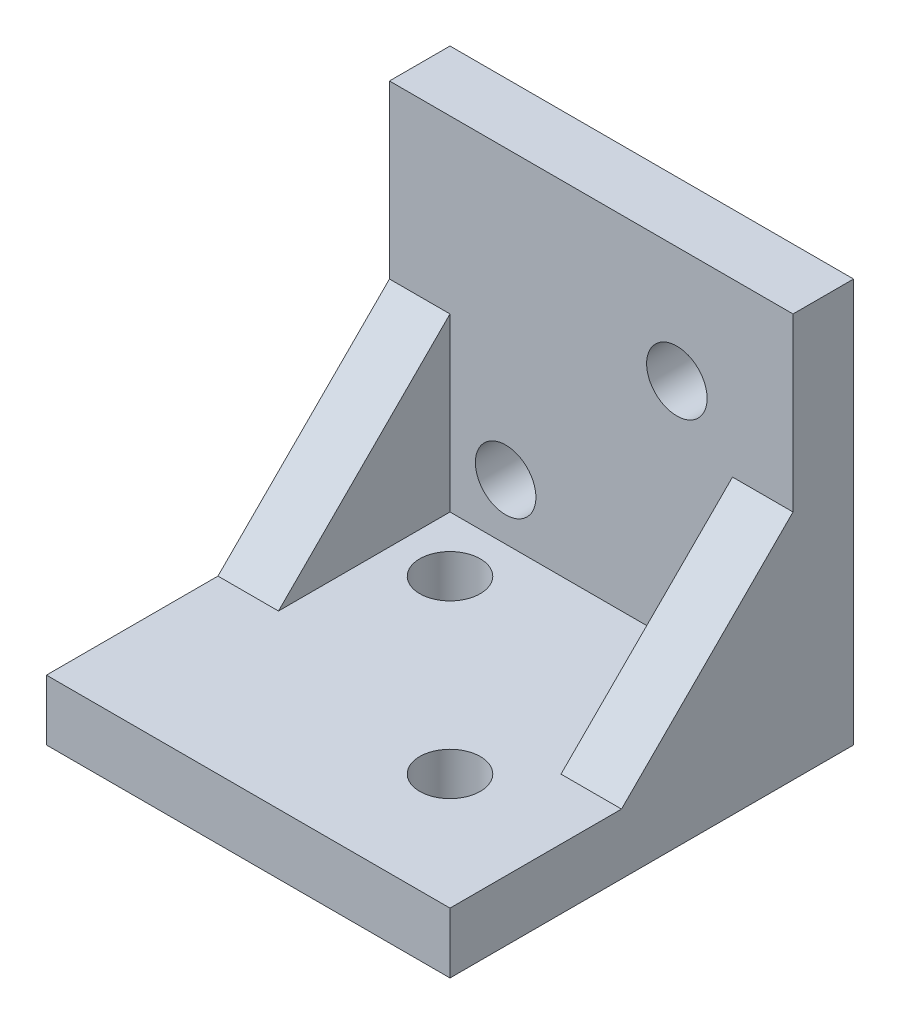
ISO-10303-21;
HEADER;
FILE_DESCRIPTION(('STEP AP214'),'2;1');
FILE_NAME('part.step','',(''),(''),'','','');
FILE_SCHEMA(('AUTOMOTIVE_DESIGN { 1 0 10303 214 1 1 1 1 }'));
ENDSEC;
DATA;
#1=APPLICATION_CONTEXT('core data for automotive mechanical design processes');
#2=APPLICATION_PROTOCOL_DEFINITION('international standard','automotive_design',2000,#1);
#3=PRODUCT_CONTEXT('',#1,'mechanical');
#4=PRODUCT('Part','Part','',(#3));
#5=PRODUCT_RELATED_PRODUCT_CATEGORY('part','',(#4));
#6=PRODUCT_DEFINITION_FORMATION('','',#4);
#7=PRODUCT_DEFINITION_CONTEXT('part definition',#1,'design');
#8=PRODUCT_DEFINITION('design','',#6,#7);
#9=PRODUCT_DEFINITION_SHAPE('','',#8);
#10=(LENGTH_UNIT() NAMED_UNIT(*) SI_UNIT(.MILLI.,.METRE.));
#11=(NAMED_UNIT(*) PLANE_ANGLE_UNIT() SI_UNIT($,.RADIAN.));
#12=(NAMED_UNIT(*) SI_UNIT($,.STERADIAN.) SOLID_ANGLE_UNIT());
#13=UNCERTAINTY_MEASURE_WITH_UNIT(LENGTH_MEASURE(1.E-05),#10,'distance_accuracy_value','');
#14=(GEOMETRIC_REPRESENTATION_CONTEXT(3) GLOBAL_UNCERTAINTY_ASSIGNED_CONTEXT((#13)) GLOBAL_UNIT_ASSIGNED_CONTEXT((#10,
#11,#12)) REPRESENTATION_CONTEXT('',''));
#15=CARTESIAN_POINT('',(0.,0.,0.));
#16=DIRECTION('',(0.,0.,1.));
#17=DIRECTION('',(1.,0.,0.));
#18=AXIS2_PLACEMENT_3D('',#15,#16,#17);
#19=CARTESIAN_POINT('',(0.,3.,0.));
#20=DIRECTION('',(0.,-1.,0.));
#21=DIRECTION('',(0.,0.,-1.));
#22=AXIS2_PLACEMENT_3D('',#19,#20,#21);
#23=PLANE('',#22);
#24=CARTESIAN_POINT('',(-4.24264068711929,3.,-4.24264068711928));
#25=DIRECTION('',(0.,1.,0.));
#26=DIRECTION('',(0.,0.,1.));
#27=AXIS2_PLACEMENT_3D('',#24,#25,#26);
#28=CIRCLE('',#27,1.50000000000001);
#29=CARTESIAN_POINT('',(-4.24264068711929,3.,-2.74264068711928));
#30=VERTEX_POINT('',#29);
#31=EDGE_CURVE('E215',#30,#30,#28,.T.);
#32=ORIENTED_EDGE('',*,*,#31,.F.);
#33=EDGE_LOOP('',(#32));
#34=FACE_BOUND('',#33,.T.);
#35=CARTESIAN_POINT('',(4.24264068711928,3.,4.24264068711928));
#36=DIRECTION('',(0.,1.,0.));
#37=DIRECTION('',(0.,0.,1.));
#38=AXIS2_PLACEMENT_3D('',#35,#36,#37);
#39=CIRCLE('',#38,1.5);
#40=CARTESIAN_POINT('',(4.24264068711928,3.,5.74264068711928));
#41=VERTEX_POINT('',#40);
#42=EDGE_CURVE('E207',#41,#41,#39,.T.);
#43=ORIENTED_EDGE('',*,*,#42,.F.);
#44=EDGE_LOOP('',(#43));
#45=FACE_BOUND('',#44,.T.);
#46=DIRECTION('',(1.,0.,0.));
#47=VECTOR('',#46,1.);
#48=CARTESIAN_POINT('',(7.,3.,1.5));
#49=LINE('',#48,#47);
#50=CARTESIAN_POINT('',(7.,3.,1.5));
#51=VERTEX_POINT('',#50);
#52=CARTESIAN_POINT('',(10.,3.,1.5));
#53=VERTEX_POINT('',#52);
#54=EDGE_CURVE('E142',#51,#53,#49,.T.);
#55=ORIENTED_EDGE('',*,*,#54,.F.);
#56=DIRECTION('',(0.,0.,1.));
#57=VECTOR('',#56,1.);
#58=CARTESIAN_POINT('',(7.,3.,10.));
#59=LINE('',#58,#57);
#60=CARTESIAN_POINT('',(7.,3.,-7.));
#61=VERTEX_POINT('',#60);
#62=EDGE_CURVE('E127',#61,#51,#59,.T.);
#63=ORIENTED_EDGE('',*,*,#62,.F.);
#64=DIRECTION('',(1.,0.,0.));
#65=VECTOR('',#64,1.);
#66=CARTESIAN_POINT('',(-10.,3.,-7.));
#67=LINE('',#66,#65);
#68=CARTESIAN_POINT('',(-7.,3.,-7.));
#69=VERTEX_POINT('',#68);
#70=EDGE_CURVE('E146',#69,#61,#67,.T.);
#71=ORIENTED_EDGE('',*,*,#70,.F.);
#72=DIRECTION('',(0.,0.,1.));
#73=VECTOR('',#72,1.);
#74=CARTESIAN_POINT('',(-7.,3.,1.5));
#75=LINE('',#74,#73);
#76=CARTESIAN_POINT('',(-7.,3.,1.5));
#77=VERTEX_POINT('',#76);
#78=EDGE_CURVE('E61',#69,#77,#75,.T.);
#79=ORIENTED_EDGE('',*,*,#78,.T.);
#80=DIRECTION('',(-1.,0.,0.));
#81=VECTOR('',#80,1.);
#82=CARTESIAN_POINT('',(-7.,3.,1.5));
#83=LINE('',#82,#81);
#84=CARTESIAN_POINT('',(-10.,3.,1.5));
#85=VERTEX_POINT('',#84);
#86=EDGE_CURVE('E65',#77,#85,#83,.T.);
#87=ORIENTED_EDGE('',*,*,#86,.T.);
#88=DIRECTION('',(0.,0.,1.));
#89=VECTOR('',#88,1.);
#90=CARTESIAN_POINT('',(-10.,3.,10.));
#91=LINE('',#90,#89);
#92=CARTESIAN_POINT('',(-10.,3.,10.));
#93=VERTEX_POINT('',#92);
#94=EDGE_CURVE('E227',#85,#93,#91,.T.);
#95=ORIENTED_EDGE('',*,*,#94,.T.);
#96=DIRECTION('',(1.,0.,0.));
#97=VECTOR('',#96,1.);
#98=CARTESIAN_POINT('',(-10.,3.,10.));
#99=LINE('',#98,#97);
#100=CARTESIAN_POINT('',(10.,3.,10.));
#101=VERTEX_POINT('',#100);
#102=EDGE_CURVE('E231',#93,#101,#99,.T.);
#103=ORIENTED_EDGE('',*,*,#102,.T.);
#104=DIRECTION('',(0.,0.,-1.));
#105=VECTOR('',#104,1.);
#106=CARTESIAN_POINT('',(10.,3.,10.));
#107=LINE('',#106,#105);
#108=EDGE_CURVE('E223',#101,#53,#107,.T.);
#109=ORIENTED_EDGE('',*,*,#108,.T.);
#110=EDGE_LOOP('',(#55,#63,#71,#79,#87,#95,#103,#109));
#111=FACE_BOUND('',#110,.T.);
#112=ADVANCED_FACE('F43',(#34,#45,#111),#23,.F.);
#113=CARTESIAN_POINT('',(-10.,20.,-7.));
#114=DIRECTION('',(0.,0.,-1.));
#115=DIRECTION('',(-1.,0.,0.));
#116=AXIS2_PLACEMENT_3D('',#113,#114,#115);
#117=PLANE('',#116);
#118=CARTESIAN_POINT('',(-4.24264068711928,5.75735931288072,-7.));
#119=DIRECTION('',(0.,0.,-1.));
#120=DIRECTION('',(-1.,0.,0.));
#121=AXIS2_PLACEMENT_3D('',#118,#119,#120);
#122=CIRCLE('',#121,1.5);
#123=CARTESIAN_POINT('',(-5.74264068711928,5.75735931288072,-7.));
#124=VERTEX_POINT('',#123);
#125=EDGE_CURVE('E179',#124,#124,#122,.T.);
#126=ORIENTED_EDGE('',*,*,#125,.T.);
#127=EDGE_LOOP('',(#126));
#128=FACE_BOUND('',#127,.T.);
#129=CARTESIAN_POINT('',(4.24264068711928,14.2426406871193,-7.));
#130=DIRECTION('',(0.,0.,-1.));
#131=DIRECTION('',(-1.,0.,0.));
#132=AXIS2_PLACEMENT_3D('',#129,#130,#131);
#133=CIRCLE('',#132,1.5);
#134=CARTESIAN_POINT('',(2.74264068711928,14.2426406871193,-7.));
#135=VERTEX_POINT('',#134);
#136=EDGE_CURVE('E47',#135,#135,#133,.T.);
#137=ORIENTED_EDGE('',*,*,#136,.T.);
#138=EDGE_LOOP('',(#137));
#139=FACE_BOUND('',#138,.T.);
#140=DIRECTION('',(1.,0.,0.));
#141=VECTOR('',#140,1.);
#142=CARTESIAN_POINT('',(7.,11.5,-7.));
#143=LINE('',#142,#141);
#144=CARTESIAN_POINT('',(7.,11.5,-7.));
#145=VERTEX_POINT('',#144);
#146=CARTESIAN_POINT('',(10.,11.5,-7.));
#147=VERTEX_POINT('',#146);
#148=EDGE_CURVE('E134',#145,#147,#143,.T.);
#149=ORIENTED_EDGE('',*,*,#148,.T.);
#150=DIRECTION('',(0.,-1.,0.));
#151=VECTOR('',#150,1.);
#152=CARTESIAN_POINT('',(10.,20.,-7.));
#153=LINE('',#152,#151);
#154=CARTESIAN_POINT('',(10.,20.,-7.));
#155=VERTEX_POINT('',#154);
#156=EDGE_CURVE('E198',#155,#147,#153,.T.);
#157=ORIENTED_EDGE('',*,*,#156,.F.);
#158=DIRECTION('',(1.,0.,0.));
#159=VECTOR('',#158,1.);
#160=CARTESIAN_POINT('',(-10.,20.,-7.));
#161=LINE('',#160,#159);
#162=CARTESIAN_POINT('',(-10.,20.,-7.));
#163=VERTEX_POINT('',#162);
#164=EDGE_CURVE('E187',#163,#155,#161,.T.);
#165=ORIENTED_EDGE('',*,*,#164,.F.);
#166=DIRECTION('',(0.,-1.,0.));
#167=VECTOR('',#166,1.);
#168=CARTESIAN_POINT('',(-10.,20.,-7.));
#169=LINE('',#168,#167);
#170=CARTESIAN_POINT('',(-10.,11.5,-7.));
#171=VERTEX_POINT('',#170);
#172=EDGE_CURVE('E203',#163,#171,#169,.T.);
#173=ORIENTED_EDGE('',*,*,#172,.T.);
#174=DIRECTION('',(-1.,0.,0.));
#175=VECTOR('',#174,1.);
#176=CARTESIAN_POINT('',(-7.,11.5,-7.));
#177=LINE('',#176,#175);
#178=CARTESIAN_POINT('',(-7.,11.5,-7.));
#179=VERTEX_POINT('',#178);
#180=EDGE_CURVE('E168',#179,#171,#177,.T.);
#181=ORIENTED_EDGE('',*,*,#180,.F.);
#182=DIRECTION('',(0.,-1.,0.));
#183=VECTOR('',#182,1.);
#184=CARTESIAN_POINT('',(-7.,3.,-7.));
#185=LINE('',#184,#183);
#186=EDGE_CURVE('E156',#179,#69,#185,.T.);
#187=ORIENTED_EDGE('',*,*,#186,.T.);
#188=ORIENTED_EDGE('',*,*,#70,.T.);
#189=DIRECTION('',(0.,-1.,0.));
#190=VECTOR('',#189,1.);
#191=CARTESIAN_POINT('',(7.,3.,-7.));
#192=LINE('',#191,#190);
#193=EDGE_CURVE('E125',#145,#61,#192,.T.);
#194=ORIENTED_EDGE('',*,*,#193,.F.);
#195=EDGE_LOOP('',(#149,#157,#165,#173,#181,#187,#188,#194));
#196=FACE_BOUND('',#195,.T.);
#197=ADVANCED_FACE('F145',(#128,#139,#196),#117,.F.);
#198=CARTESIAN_POINT('',(0.,0.,0.));
#199=DIRECTION('',(0.,-1.,0.));
#200=DIRECTION('',(0.,0.,-1.));
#201=AXIS2_PLACEMENT_3D('',#198,#199,#200);
#202=PLANE('',#201);
#203=CARTESIAN_POINT('',(-4.24264068711929,0.,-4.24264068711928));
#204=DIRECTION('',(0.,1.,0.));
#205=DIRECTION('',(0.,0.,1.));
#206=AXIS2_PLACEMENT_3D('',#203,#204,#205);
#207=CIRCLE('',#206,1.50000000000001);
#208=CARTESIAN_POINT('',(-4.24264068711929,0.,-2.74264068711928));
#209=VERTEX_POINT('',#208);
#210=EDGE_CURVE('E211',#209,#209,#207,.T.);
#211=ORIENTED_EDGE('',*,*,#210,.T.);
#212=EDGE_LOOP('',(#211));
#213=FACE_BOUND('',#212,.T.);
#214=DIRECTION('',(0.,0.,-1.));
#215=VECTOR('',#214,1.);
#216=CARTESIAN_POINT('',(10.,0.,10.));
#217=LINE('',#216,#215);
#218=CARTESIAN_POINT('',(10.,0.,10.));
#219=VERTEX_POINT('',#218);
#220=CARTESIAN_POINT('',(10.,0.,-10.));
#221=VERTEX_POINT('',#220);
#222=EDGE_CURVE('E219',#219,#221,#217,.T.);
#223=ORIENTED_EDGE('',*,*,#222,.F.);
#224=DIRECTION('',(1.,0.,0.));
#225=VECTOR('',#224,1.);
#226=CARTESIAN_POINT('',(-10.,0.,10.));
#227=LINE('',#226,#225);
#228=CARTESIAN_POINT('',(-10.,0.,10.));
#229=VERTEX_POINT('',#228);
#230=EDGE_CURVE('E228',#229,#219,#227,.T.);
#231=ORIENTED_EDGE('',*,*,#230,.F.);
#232=DIRECTION('',(0.,0.,1.));
#233=VECTOR('',#232,1.);
#234=CARTESIAN_POINT('',(-10.,0.,10.));
#235=LINE('',#234,#233);
#236=CARTESIAN_POINT('',(-10.,0.,-10.));
#237=VERTEX_POINT('',#236);
#238=EDGE_CURVE('E241',#237,#229,#235,.T.);
#239=ORIENTED_EDGE('',*,*,#238,.F.);
#240=DIRECTION('',(-1.,0.,0.));
#241=VECTOR('',#240,1.);
#242=CARTESIAN_POINT('',(-10.,0.,-10.));
#243=LINE('',#242,#241);
#244=EDGE_CURVE('E238',#221,#237,#243,.T.);
#245=ORIENTED_EDGE('',*,*,#244,.F.);
#246=EDGE_LOOP('',(#223,#231,#239,#245));
#247=FACE_BOUND('',#246,.T.);
#248=CARTESIAN_POINT('',(4.24264068711928,0.,4.24264068711928));
#249=DIRECTION('',(0.,1.,0.));
#250=DIRECTION('',(0.,0.,1.));
#251=AXIS2_PLACEMENT_3D('',#248,#249,#250);
#252=CIRCLE('',#251,1.5);
#253=CARTESIAN_POINT('',(4.24264068711928,0.,5.74264068711928));
#254=VERTEX_POINT('',#253);
#255=EDGE_CURVE('E206',#254,#254,#252,.T.);
#256=ORIENTED_EDGE('',*,*,#255,.T.);
#257=EDGE_LOOP('',(#256));
#258=FACE_BOUND('',#257,.T.);
#259=ADVANCED_FACE('F286',(#213,#247,#258),#202,.T.);
#260=CARTESIAN_POINT('',(10.,3.,10.));
#261=DIRECTION('',(-1.,0.,0.));
#262=DIRECTION('',(0.,0.,1.));
#263=AXIS2_PLACEMENT_3D('',#260,#261,#262);
#264=PLANE('',#263);
#265=DIRECTION('',(0.,0.707106781186548,-0.707106781186547));
#266=VECTOR('',#265,1.);
#267=CARTESIAN_POINT('',(10.,-1.25,5.75));
#268=LINE('',#267,#266);
#269=EDGE_CURVE('E131',#53,#147,#268,.T.);
#270=ORIENTED_EDGE('',*,*,#269,.F.);
#271=ORIENTED_EDGE('',*,*,#108,.F.);
#272=DIRECTION('',(0.,-1.,0.));
#273=VECTOR('',#272,1.);
#274=CARTESIAN_POINT('',(10.,3.,10.));
#275=LINE('',#274,#273);
#276=EDGE_CURVE('E234',#101,#219,#275,.T.);
#277=ORIENTED_EDGE('',*,*,#276,.T.);
#278=ORIENTED_EDGE('',*,*,#222,.T.);
#279=DIRECTION('',(0.,-1.,0.));
#280=VECTOR('',#279,1.);
#281=CARTESIAN_POINT('',(10.,3.,-10.));
#282=LINE('',#281,#280);
#283=CARTESIAN_POINT('',(10.,20.,-10.));
#284=VERTEX_POINT('',#283);
#285=EDGE_CURVE('E11',#284,#221,#282,.T.);
#286=ORIENTED_EDGE('',*,*,#285,.F.);
#287=DIRECTION('',(0.,0.,-1.));
#288=VECTOR('',#287,1.);
#289=CARTESIAN_POINT('',(10.,20.,-10.));
#290=LINE('',#289,#288);
#291=EDGE_CURVE('E190',#155,#284,#290,.T.);
#292=ORIENTED_EDGE('',*,*,#291,.F.);
#293=ORIENTED_EDGE('',*,*,#156,.T.);
#294=EDGE_LOOP('',(#270,#271,#277,#278,#286,#292,#293));
#295=FACE_BOUND('',#294,.T.);
#296=ADVANCED_FACE('F45',(#295),#264,.F.);
#297=CARTESIAN_POINT('',(-10.,3.,-10.));
#298=DIRECTION('',(0.,0.,1.));
#299=DIRECTION('',(1.,0.,0.));
#300=AXIS2_PLACEMENT_3D('',#297,#298,#299);
#301=PLANE('',#300);
#302=CARTESIAN_POINT('',(4.24264068711928,14.2426406871193,-10.));
#303=DIRECTION('',(0.,0.,-1.));
#304=DIRECTION('',(-1.,0.,0.));
#305=AXIS2_PLACEMENT_3D('',#302,#303,#304);
#306=CIRCLE('',#305,1.5);
#307=CARTESIAN_POINT('',(2.74264068711928,14.2426406871193,-10.));
#308=VERTEX_POINT('',#307);
#309=EDGE_CURVE('E175',#308,#308,#306,.T.);
#310=ORIENTED_EDGE('',*,*,#309,.F.);
#311=EDGE_LOOP('',(#310));
#312=FACE_BOUND('',#311,.T.);
#313=CARTESIAN_POINT('',(-4.24264068711928,5.75735931288072,-10.));
#314=DIRECTION('',(0.,0.,-1.));
#315=DIRECTION('',(-1.,0.,0.));
#316=AXIS2_PLACEMENT_3D('',#313,#314,#315);
#317=CIRCLE('',#316,1.5);
#318=CARTESIAN_POINT('',(-5.74264068711928,5.75735931288072,-10.));
#319=VERTEX_POINT('',#318);
#320=EDGE_CURVE('E172',#319,#319,#317,.T.);
#321=ORIENTED_EDGE('',*,*,#320,.F.);
#322=EDGE_LOOP('',(#321));
#323=FACE_BOUND('',#322,.T.);
#324=ORIENTED_EDGE('',*,*,#244,.T.);
#325=DIRECTION('',(0.,-1.,0.));
#326=VECTOR('',#325,1.);
#327=CARTESIAN_POINT('',(-10.,3.,-10.));
#328=LINE('',#327,#326);
#329=CARTESIAN_POINT('',(-10.,20.,-10.));
#330=VERTEX_POINT('',#329);
#331=EDGE_CURVE('E53',#330,#237,#328,.T.);
#332=ORIENTED_EDGE('',*,*,#331,.F.);
#333=DIRECTION('',(-1.,0.,0.));
#334=VECTOR('',#333,1.);
#335=CARTESIAN_POINT('',(-10.,20.,-10.));
#336=LINE('',#335,#334);
#337=EDGE_CURVE('E194',#284,#330,#336,.T.);
#338=ORIENTED_EDGE('',*,*,#337,.F.);
#339=ORIENTED_EDGE('',*,*,#285,.T.);
#340=EDGE_LOOP('',(#324,#332,#338,#339));
#341=FACE_BOUND('',#340,.T.);
#342=ADVANCED_FACE('F303',(#312,#323,#341),#301,.F.);
#343=CARTESIAN_POINT('',(-10.,3.,10.));
#344=DIRECTION('',(1.,0.,0.));
#345=DIRECTION('',(0.,0.,-1.));
#346=AXIS2_PLACEMENT_3D('',#343,#344,#345);
#347=PLANE('',#346);
#348=ORIENTED_EDGE('',*,*,#94,.F.);
#349=DIRECTION('',(0.,0.707106781186548,-0.707106781186547));
#350=VECTOR('',#349,1.);
#351=CARTESIAN_POINT('',(-10.,11.5,-7.));
#352=LINE('',#351,#350);
#353=EDGE_CURVE('E141',#85,#171,#352,.T.);
#354=ORIENTED_EDGE('',*,*,#353,.T.);
#355=ORIENTED_EDGE('',*,*,#172,.F.);
#356=DIRECTION('',(0.,0.,1.));
#357=VECTOR('',#356,1.);
#358=CARTESIAN_POINT('',(-10.,20.,-10.));
#359=LINE('',#358,#357);
#360=EDGE_CURVE('E183',#330,#163,#359,.T.);
#361=ORIENTED_EDGE('',*,*,#360,.F.);
#362=ORIENTED_EDGE('',*,*,#331,.T.);
#363=ORIENTED_EDGE('',*,*,#238,.T.);
#364=DIRECTION('',(0.,-1.,0.));
#365=VECTOR('',#364,1.);
#366=CARTESIAN_POINT('',(-10.,3.,10.));
#367=LINE('',#366,#365);
#368=EDGE_CURVE('E249',#93,#229,#367,.T.);
#369=ORIENTED_EDGE('',*,*,#368,.F.);
#370=EDGE_LOOP('',(#348,#354,#355,#361,#362,#363,#369));
#371=FACE_BOUND('',#370,.T.);
#372=ADVANCED_FACE('F300',(#371),#347,.F.);
#373=CARTESIAN_POINT('',(-10.,3.,10.));
#374=DIRECTION('',(0.,0.,-1.));
#375=DIRECTION('',(-1.,0.,0.));
#376=AXIS2_PLACEMENT_3D('',#373,#374,#375);
#377=PLANE('',#376);
#378=ORIENTED_EDGE('',*,*,#230,.T.);
#379=ORIENTED_EDGE('',*,*,#276,.F.);
#380=ORIENTED_EDGE('',*,*,#102,.F.);
#381=ORIENTED_EDGE('',*,*,#368,.T.);
#382=EDGE_LOOP('',(#378,#379,#380,#381));
#383=FACE_BOUND('',#382,.T.);
#384=ADVANCED_FACE('F297',(#383),#377,.F.);
#385=CARTESIAN_POINT('',(-4.24264068711929,3.,-4.24264068711928));
#386=DIRECTION('',(0.,-1.,0.));
#387=DIRECTION('',(0.,0.,-1.));
#388=AXIS2_PLACEMENT_3D('',#385,#386,#387);
#389=CYLINDRICAL_SURFACE('',#388,1.50000000000001);
#390=ORIENTED_EDGE('',*,*,#31,.T.);
#391=EDGE_LOOP('',(#390));
#392=FACE_BOUND('',#391,.T.);
#393=ORIENTED_EDGE('',*,*,#210,.F.);
#394=EDGE_LOOP('',(#393));
#395=FACE_BOUND('',#394,.T.);
#396=ADVANCED_FACE('F292',(#392,#395),#389,.F.);
#397=CARTESIAN_POINT('',(4.24264068711928,3.,4.24264068711928));
#398=DIRECTION('',(0.,-1.,0.));
#399=DIRECTION('',(0.,0.,-1.));
#400=AXIS2_PLACEMENT_3D('',#397,#398,#399);
#401=CYLINDRICAL_SURFACE('',#400,1.5);
#402=ORIENTED_EDGE('',*,*,#42,.T.);
#403=EDGE_LOOP('',(#402));
#404=FACE_BOUND('',#403,.T.);
#405=ORIENTED_EDGE('',*,*,#255,.F.);
#406=EDGE_LOOP('',(#405));
#407=FACE_BOUND('',#406,.T.);
#408=ADVANCED_FACE('F409',(#404,#407),#401,.F.);
#409=CARTESIAN_POINT('',(0.,20.,0.));
#410=DIRECTION('',(0.,1.,0.));
#411=DIRECTION('',(0.,0.,1.));
#412=AXIS2_PLACEMENT_3D('',#409,#410,#411);
#413=PLANE('',#412);
#414=ORIENTED_EDGE('',*,*,#360,.T.);
#415=ORIENTED_EDGE('',*,*,#164,.T.);
#416=ORIENTED_EDGE('',*,*,#291,.T.);
#417=ORIENTED_EDGE('',*,*,#337,.T.);
#418=EDGE_LOOP('',(#414,#415,#416,#417));
#419=FACE_BOUND('',#418,.T.);
#420=ADVANCED_FACE('F277',(#419),#413,.T.);
#421=CARTESIAN_POINT('',(-4.24264068711928,5.75735931288072,20.));
#422=DIRECTION('',(0.,0.,-1.));
#423=DIRECTION('',(-1.,0.,0.));
#424=AXIS2_PLACEMENT_3D('',#421,#422,#423);
#425=CYLINDRICAL_SURFACE('',#424,1.5);
#426=ORIENTED_EDGE('',*,*,#320,.T.);
#427=EDGE_LOOP('',(#426));
#428=FACE_BOUND('',#427,.T.);
#429=ORIENTED_EDGE('',*,*,#125,.F.);
#430=EDGE_LOOP('',(#429));
#431=FACE_BOUND('',#430,.T.);
#432=ADVANCED_FACE('F267',(#428,#431),#425,.F.);
#433=CARTESIAN_POINT('',(4.24264068711928,14.2426406871193,20.));
#434=DIRECTION('',(0.,0.,-1.));
#435=DIRECTION('',(-1.,0.,0.));
#436=AXIS2_PLACEMENT_3D('',#433,#434,#435);
#437=CYLINDRICAL_SURFACE('',#436,1.5);
#438=ORIENTED_EDGE('',*,*,#309,.T.);
#439=EDGE_LOOP('',(#438));
#440=FACE_BOUND('',#439,.T.);
#441=ORIENTED_EDGE('',*,*,#136,.F.);
#442=EDGE_LOOP('',(#441));
#443=FACE_BOUND('',#442,.T.);
#444=ADVANCED_FACE('F264',(#440,#443),#437,.F.);
#445=CARTESIAN_POINT('',(-7.,11.5,-7.));
#446=DIRECTION('',(0.,0.707106781186547,0.707106781186548));
#447=DIRECTION('',(0.,-0.707106781186548,0.707106781186547));
#448=AXIS2_PLACEMENT_3D('',#445,#446,#447);
#449=PLANE('',#448);
#450=ORIENTED_EDGE('',*,*,#353,.F.);
#451=ORIENTED_EDGE('',*,*,#86,.F.);
#452=DIRECTION('',(0.,0.707106781186548,-0.707106781186547));
#453=VECTOR('',#452,1.);
#454=CARTESIAN_POINT('',(-7.,11.5,-7.));
#455=LINE('',#454,#453);
#456=EDGE_CURVE('E161',#77,#179,#455,.T.);
#457=ORIENTED_EDGE('',*,*,#456,.T.);
#458=ORIENTED_EDGE('',*,*,#180,.T.);
#459=EDGE_LOOP('',(#450,#451,#457,#458));
#460=FACE_BOUND('',#459,.T.);
#461=ADVANCED_FACE('F266',(#460),#449,.T.);
#462=CARTESIAN_POINT('',(-7.,0.,0.));
#463=DIRECTION('',(-1.,0.,0.));
#464=DIRECTION('',(0.,0.,1.));
#465=AXIS2_PLACEMENT_3D('',#462,#463,#464);
#466=PLANE('',#465);
#467=ORIENTED_EDGE('',*,*,#186,.F.);
#468=ORIENTED_EDGE('',*,*,#456,.F.);
#469=ORIENTED_EDGE('',*,*,#78,.F.);
#470=EDGE_LOOP('',(#467,#468,#469));
#471=FACE_BOUND('',#470,.T.);
#472=ADVANCED_FACE('F274',(#471),#466,.F.);
#473=CARTESIAN_POINT('',(7.,-1.25,5.75));
#474=DIRECTION('',(0.,-0.707106781186547,-0.707106781186548));
#475=DIRECTION('',(0.,0.707106781186548,-0.707106781186547));
#476=AXIS2_PLACEMENT_3D('',#473,#474,#475);
#477=PLANE('',#476);
#478=ORIENTED_EDGE('',*,*,#269,.T.);
#479=ORIENTED_EDGE('',*,*,#148,.F.);
#480=DIRECTION('',(0.,0.707106781186548,-0.707106781186547));
#481=VECTOR('',#480,1.);
#482=CARTESIAN_POINT('',(7.,-1.25,5.75));
#483=LINE('',#482,#481);
#484=EDGE_CURVE('E121',#51,#145,#483,.T.);
#485=ORIENTED_EDGE('',*,*,#484,.F.);
#486=ORIENTED_EDGE('',*,*,#54,.T.);
#487=EDGE_LOOP('',(#478,#479,#485,#486));
#488=FACE_BOUND('',#487,.T.);
#489=ADVANCED_FACE('F135',(#488),#477,.F.);
#490=CARTESIAN_POINT('',(7.,0.,0.));
#491=DIRECTION('',(-1.,0.,0.));
#492=DIRECTION('',(0.,0.,1.));
#493=AXIS2_PLACEMENT_3D('',#490,#491,#492);
#494=PLANE('',#493);
#495=ORIENTED_EDGE('',*,*,#484,.T.);
#496=ORIENTED_EDGE('',*,*,#193,.T.);
#497=ORIENTED_EDGE('',*,*,#62,.T.);
#498=EDGE_LOOP('',(#495,#496,#497));
#499=FACE_BOUND('',#498,.T.);
#500=ADVANCED_FACE('F123',(#499),#494,.T.);
#501=CLOSED_SHELL('',(#112,#197,#259,#296,#342,#372,#384,#396,#408,#420,#432,#444,#461,#472,
#489,#500));
#502=MANIFOLD_SOLID_BREP('B2',#501);
#503=ADVANCED_BREP_SHAPE_REPRESENTATION('',(#18,#502),#14);
#504=SHAPE_DEFINITION_REPRESENTATION(#9,#503);
ENDSEC;
END-ISO-10303-21;
